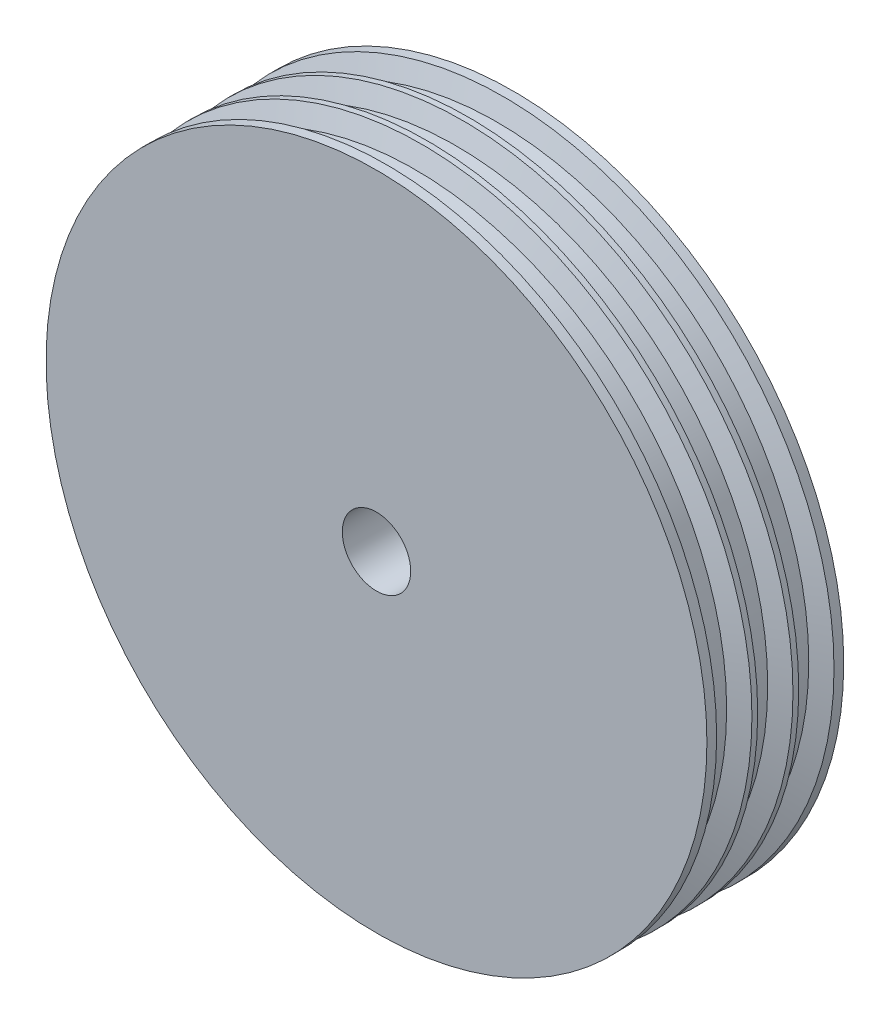
ISO-10303-21;
HEADER;
FILE_DESCRIPTION(('STEP AP214'),'2;1');
FILE_NAME('part.step','',(''),(''),'','','');
FILE_SCHEMA(('AUTOMOTIVE_DESIGN { 1 0 10303 214 1 1 1 1 }'));
ENDSEC;
DATA;
#1=APPLICATION_CONTEXT('core data for automotive mechanical design processes');
#2=APPLICATION_PROTOCOL_DEFINITION('international standard','automotive_design',2000,#1);
#3=PRODUCT_CONTEXT('',#1,'mechanical');
#4=PRODUCT('Part','Part','',(#3));
#5=PRODUCT_RELATED_PRODUCT_CATEGORY('part','',(#4));
#6=PRODUCT_DEFINITION_FORMATION('','',#4);
#7=PRODUCT_DEFINITION_CONTEXT('part definition',#1,'design');
#8=PRODUCT_DEFINITION('design','',#6,#7);
#9=PRODUCT_DEFINITION_SHAPE('','',#8);
#10=(LENGTH_UNIT() NAMED_UNIT(*) SI_UNIT(.MILLI.,.METRE.));
#11=(NAMED_UNIT(*) PLANE_ANGLE_UNIT() SI_UNIT($,.RADIAN.));
#12=(NAMED_UNIT(*) SI_UNIT($,.STERADIAN.) SOLID_ANGLE_UNIT());
#13=UNCERTAINTY_MEASURE_WITH_UNIT(LENGTH_MEASURE(1.E-05),#10,'distance_accuracy_value','');
#14=(GEOMETRIC_REPRESENTATION_CONTEXT(3) GLOBAL_UNCERTAINTY_ASSIGNED_CONTEXT((#13)) GLOBAL_UNIT_ASSIGNED_CONTEXT((#10,
#11,#12)) REPRESENTATION_CONTEXT('',''));
#15=CARTESIAN_POINT('',(0.,0.,0.));
#16=DIRECTION('',(0.,0.,1.));
#17=DIRECTION('',(1.,0.,0.));
#18=AXIS2_PLACEMENT_3D('',#15,#16,#17);
#19=CARTESIAN_POINT('',(0.,120.75,0.));
#20=DIRECTION('',(0.,0.,-1.));
#21=DIRECTION('',(-1.,0.,0.));
#22=AXIS2_PLACEMENT_3D('',#19,#20,#21);
#23=PLANE('',#22);
#24=CARTESIAN_POINT('',(0.,0.,0.));
#25=DIRECTION('',(0.,0.,1.));
#26=DIRECTION('',(1.,0.,0.));
#27=AXIS2_PLACEMENT_3D('',#24,#25,#26);
#28=CIRCLE('',#27,12.5);
#29=CARTESIAN_POINT('',(12.5,0.,0.));
#30=VERTEX_POINT('',#29);
#31=EDGE_CURVE('E10',#30,#30,#28,.T.);
#32=ORIENTED_EDGE('',*,*,#31,.F.);
#33=EDGE_LOOP('',(#32));
#34=FACE_BOUND('',#33,.T.);
#35=CARTESIAN_POINT('',(0.,0.,0.));
#36=DIRECTION('',(0.,0.,1.));
#37=DIRECTION('',(1.,0.,0.));
#38=AXIS2_PLACEMENT_3D('',#35,#36,#37);
#39=CIRCLE('',#38,120.75);
#40=CARTESIAN_POINT('',(120.75,0.,0.));
#41=VERTEX_POINT('',#40);
#42=EDGE_CURVE('E110',#41,#41,#39,.T.);
#43=ORIENTED_EDGE('',*,*,#42,.T.);
#44=EDGE_LOOP('',(#43));
#45=FACE_BOUND('',#44,.T.);
#46=ADVANCED_FACE('F43',(#34,#45),#23,.F.);
#47=CARTESIAN_POINT('',(0.,0.,0.));
#48=DIRECTION('',(0.,0.,1.));
#49=DIRECTION('',(1.,0.,0.));
#50=AXIS2_PLACEMENT_3D('',#47,#48,#49);
#51=CYLINDRICAL_SURFACE('',#50,12.5);
#52=CARTESIAN_POINT('',(0.,0.,-50.));
#53=DIRECTION('',(0.,0.,1.));
#54=DIRECTION('',(1.,0.,0.));
#55=AXIS2_PLACEMENT_3D('',#52,#53,#54);
#56=CIRCLE('',#55,12.5);
#57=CARTESIAN_POINT('',(12.5,0.,-50.));
#58=VERTEX_POINT('',#57);
#59=EDGE_CURVE('E50',#58,#58,#56,.T.);
#60=ORIENTED_EDGE('',*,*,#59,.F.);
#61=EDGE_LOOP('',(#60));
#62=FACE_BOUND('',#61,.T.);
#63=ORIENTED_EDGE('',*,*,#31,.T.);
#64=EDGE_LOOP('',(#63));
#65=FACE_BOUND('',#64,.T.);
#66=ADVANCED_FACE('F196',(#62,#65),#51,.F.);
#67=CARTESIAN_POINT('',(0.,120.75,-50.));
#68=DIRECTION('',(0.,0.,1.));
#69=DIRECTION('',(1.,0.,0.));
#70=AXIS2_PLACEMENT_3D('',#67,#68,#69);
#71=PLANE('',#70);
#72=CARTESIAN_POINT('',(0.,0.,-50.));
#73=DIRECTION('',(0.,0.,1.));
#74=DIRECTION('',(1.,0.,0.));
#75=AXIS2_PLACEMENT_3D('',#72,#73,#74);
#76=CIRCLE('',#75,120.75);
#77=CARTESIAN_POINT('',(120.75,0.,-50.));
#78=VERTEX_POINT('',#77);
#79=EDGE_CURVE('E55',#78,#78,#76,.T.);
#80=ORIENTED_EDGE('',*,*,#79,.F.);
#81=EDGE_LOOP('',(#80));
#82=FACE_BOUND('',#81,.T.);
#83=ORIENTED_EDGE('',*,*,#59,.T.);
#84=EDGE_LOOP('',(#83));
#85=FACE_BOUND('',#84,.T.);
#86=ADVANCED_FACE('F191',(#82,#85),#71,.F.);
#87=CARTESIAN_POINT('',(0.,0.,0.));
#88=DIRECTION('',(0.,0.,1.));
#89=DIRECTION('',(1.,0.,0.));
#90=AXIS2_PLACEMENT_3D('',#87,#88,#89);
#91=CYLINDRICAL_SURFACE('',#90,120.75);
#92=CARTESIAN_POINT('',(0.,0.,-46.4469009365466));
#93=DIRECTION('',(0.,0.,1.));
#94=DIRECTION('',(1.,0.,0.));
#95=AXIS2_PLACEMENT_3D('',#92,#93,#94);
#96=CIRCLE('',#95,120.75);
#97=CARTESIAN_POINT('',(120.75,0.,-46.4469009365466));
#98=VERTEX_POINT('',#97);
#99=EDGE_CURVE('E60',#98,#98,#96,.T.);
#100=ORIENTED_EDGE('',*,*,#99,.F.);
#101=EDGE_LOOP('',(#100));
#102=FACE_BOUND('',#101,.T.);
#103=ORIENTED_EDGE('',*,*,#79,.T.);
#104=EDGE_LOOP('',(#103));
#105=FACE_BOUND('',#104,.T.);
#106=ADVANCED_FACE('F185',(#102,#105),#91,.T.);
#107=CARTESIAN_POINT('',(0.,0.,-46.4469009365466));
#108=DIRECTION('',(0.,0.,-1.));
#109=DIRECTION('',(-1.,0.,0.));
#110=AXIS2_PLACEMENT_3D('',#107,#108,#109);
#111=CONICAL_SURFACE('',#110,120.75,1.23918376891597);
#112=CARTESIAN_POINT('',(0.,0.,-44.0817349666014));
#113=DIRECTION('',(0.,0.,1.));
#114=DIRECTION('',(1.,0.,0.));
#115=AXIS2_PLACEMENT_3D('',#112,#113,#114);
#116=CIRCLE('',#115,113.881059262577);
#117=CARTESIAN_POINT('',(113.881059262577,0.,-44.0817349666014));
#118=VERTEX_POINT('',#117);
#119=EDGE_CURVE('E66',#118,#118,#116,.T.);
#120=ORIENTED_EDGE('',*,*,#119,.F.);
#121=EDGE_LOOP('',(#120));
#122=FACE_BOUND('',#121,.T.);
#123=ORIENTED_EDGE('',*,*,#99,.T.);
#124=EDGE_LOOP('',(#123));
#125=FACE_BOUND('',#124,.T.);
#126=ADVANCED_FACE('F179',(#122,#125),#111,.T.);
#127=CARTESIAN_POINT('',(0.,0.,0.));
#128=DIRECTION('',(0.,0.,1.));
#129=DIRECTION('',(1.,0.,0.));
#130=AXIS2_PLACEMENT_3D('',#127,#128,#129);
#131=CYLINDRICAL_SURFACE('',#130,113.881059262577);
#132=CARTESIAN_POINT('',(0.,0.,-35.9182650333986));
#133=DIRECTION('',(0.,0.,1.));
#134=DIRECTION('',(1.,0.,0.));
#135=AXIS2_PLACEMENT_3D('',#132,#133,#134);
#136=CIRCLE('',#135,113.881059262577);
#137=CARTESIAN_POINT('',(113.881059262577,0.,-35.9182650333986));
#138=VERTEX_POINT('',#137);
#139=EDGE_CURVE('E70',#138,#138,#136,.T.);
#140=ORIENTED_EDGE('',*,*,#139,.F.);
#141=EDGE_LOOP('',(#140));
#142=FACE_BOUND('',#141,.T.);
#143=ORIENTED_EDGE('',*,*,#119,.T.);
#144=EDGE_LOOP('',(#143));
#145=FACE_BOUND('',#144,.T.);
#146=ADVANCED_FACE('F173',(#142,#145),#131,.T.);
#147=CARTESIAN_POINT('',(0.,0.,-35.9182650333986));
#148=DIRECTION('',(0.,0.,1.));
#149=DIRECTION('',(1.,0.,0.));
#150=AXIS2_PLACEMENT_3D('',#147,#148,#149);
#151=CONICAL_SURFACE('',#150,113.881059262577,1.23918376891597);
#152=CARTESIAN_POINT('',(0.,0.,-33.5530990634534));
#153=DIRECTION('',(0.,0.,1.));
#154=DIRECTION('',(1.,0.,0.));
#155=AXIS2_PLACEMENT_3D('',#152,#153,#154);
#156=CIRCLE('',#155,120.75);
#157=CARTESIAN_POINT('',(120.75,0.,-33.5530990634534));
#158=VERTEX_POINT('',#157);
#159=EDGE_CURVE('E74',#158,#158,#156,.T.);
#160=ORIENTED_EDGE('',*,*,#159,.F.);
#161=EDGE_LOOP('',(#160));
#162=FACE_BOUND('',#161,.T.);
#163=ORIENTED_EDGE('',*,*,#139,.T.);
#164=EDGE_LOOP('',(#163));
#165=FACE_BOUND('',#164,.T.);
#166=ADVANCED_FACE('F167',(#162,#165),#151,.T.);
#167=CARTESIAN_POINT('',(0.,0.,0.));
#168=DIRECTION('',(0.,0.,1.));
#169=DIRECTION('',(1.,0.,0.));
#170=AXIS2_PLACEMENT_3D('',#167,#168,#169);
#171=CYLINDRICAL_SURFACE('',#170,120.75);
#172=CARTESIAN_POINT('',(0.,0.,-31.4469009365466));
#173=DIRECTION('',(0.,0.,1.));
#174=DIRECTION('',(1.,0.,0.));
#175=AXIS2_PLACEMENT_3D('',#172,#173,#174);
#176=CIRCLE('',#175,120.75);
#177=CARTESIAN_POINT('',(120.75,0.,-31.4469009365466));
#178=VERTEX_POINT('',#177);
#179=EDGE_CURVE('E78',#178,#178,#176,.T.);
#180=ORIENTED_EDGE('',*,*,#179,.F.);
#181=EDGE_LOOP('',(#180));
#182=FACE_BOUND('',#181,.T.);
#183=ORIENTED_EDGE('',*,*,#159,.T.);
#184=EDGE_LOOP('',(#183));
#185=FACE_BOUND('',#184,.T.);
#186=ADVANCED_FACE('F161',(#182,#185),#171,.T.);
#187=CARTESIAN_POINT('',(0.,0.,-31.4469009365466));
#188=DIRECTION('',(0.,0.,-1.));
#189=DIRECTION('',(-1.,0.,0.));
#190=AXIS2_PLACEMENT_3D('',#187,#188,#189);
#191=CONICAL_SURFACE('',#190,120.75,1.23918376891597);
#192=CARTESIAN_POINT('',(0.,0.,-29.0817349666014));
#193=DIRECTION('',(0.,0.,1.));
#194=DIRECTION('',(1.,0.,0.));
#195=AXIS2_PLACEMENT_3D('',#192,#193,#194);
#196=CIRCLE('',#195,113.881059262577);
#197=CARTESIAN_POINT('',(113.881059262577,0.,-29.0817349666014));
#198=VERTEX_POINT('',#197);
#199=EDGE_CURVE('E82',#198,#198,#196,.T.);
#200=ORIENTED_EDGE('',*,*,#199,.F.);
#201=EDGE_LOOP('',(#200));
#202=FACE_BOUND('',#201,.T.);
#203=ORIENTED_EDGE('',*,*,#179,.T.);
#204=EDGE_LOOP('',(#203));
#205=FACE_BOUND('',#204,.T.);
#206=ADVANCED_FACE('F155',(#202,#205),#191,.T.);
#207=CARTESIAN_POINT('',(0.,0.,0.));
#208=DIRECTION('',(0.,0.,1.));
#209=DIRECTION('',(1.,0.,0.));
#210=AXIS2_PLACEMENT_3D('',#207,#208,#209);
#211=CYLINDRICAL_SURFACE('',#210,113.881059262577);
#212=CARTESIAN_POINT('',(0.,0.,-20.9182650333986));
#213=DIRECTION('',(0.,0.,1.));
#214=DIRECTION('',(1.,0.,0.));
#215=AXIS2_PLACEMENT_3D('',#212,#213,#214);
#216=CIRCLE('',#215,113.881059262577);
#217=CARTESIAN_POINT('',(113.881059262577,0.,-20.9182650333986));
#218=VERTEX_POINT('',#217);
#219=EDGE_CURVE('E86',#218,#218,#216,.T.);
#220=ORIENTED_EDGE('',*,*,#219,.F.);
#221=EDGE_LOOP('',(#220));
#222=FACE_BOUND('',#221,.T.);
#223=ORIENTED_EDGE('',*,*,#199,.T.);
#224=EDGE_LOOP('',(#223));
#225=FACE_BOUND('',#224,.T.);
#226=ADVANCED_FACE('F149',(#222,#225),#211,.T.);
#227=CARTESIAN_POINT('',(0.,0.,-20.9182650333986));
#228=DIRECTION('',(0.,0.,1.));
#229=DIRECTION('',(1.,0.,0.));
#230=AXIS2_PLACEMENT_3D('',#227,#228,#229);
#231=CONICAL_SURFACE('',#230,113.881059262577,1.23918376891597);
#232=CARTESIAN_POINT('',(0.,0.,-18.5530990634534));
#233=DIRECTION('',(0.,0.,1.));
#234=DIRECTION('',(1.,0.,0.));
#235=AXIS2_PLACEMENT_3D('',#232,#233,#234);
#236=CIRCLE('',#235,120.75);
#237=CARTESIAN_POINT('',(120.75,0.,-18.5530990634534));
#238=VERTEX_POINT('',#237);
#239=EDGE_CURVE('E90',#238,#238,#236,.T.);
#240=ORIENTED_EDGE('',*,*,#239,.F.);
#241=EDGE_LOOP('',(#240));
#242=FACE_BOUND('',#241,.T.);
#243=ORIENTED_EDGE('',*,*,#219,.T.);
#244=EDGE_LOOP('',(#243));
#245=FACE_BOUND('',#244,.T.);
#246=ADVANCED_FACE('F143',(#242,#245),#231,.T.);
#247=CARTESIAN_POINT('',(0.,0.,0.));
#248=DIRECTION('',(0.,0.,1.));
#249=DIRECTION('',(1.,0.,0.));
#250=AXIS2_PLACEMENT_3D('',#247,#248,#249);
#251=CYLINDRICAL_SURFACE('',#250,120.75);
#252=CARTESIAN_POINT('',(0.,0.,-16.4469009365466));
#253=DIRECTION('',(0.,0.,1.));
#254=DIRECTION('',(1.,0.,0.));
#255=AXIS2_PLACEMENT_3D('',#252,#253,#254);
#256=CIRCLE('',#255,120.75);
#257=CARTESIAN_POINT('',(120.75,0.,-16.4469009365466));
#258=VERTEX_POINT('',#257);
#259=EDGE_CURVE('E94',#258,#258,#256,.T.);
#260=ORIENTED_EDGE('',*,*,#259,.F.);
#261=EDGE_LOOP('',(#260));
#262=FACE_BOUND('',#261,.T.);
#263=ORIENTED_EDGE('',*,*,#239,.T.);
#264=EDGE_LOOP('',(#263));
#265=FACE_BOUND('',#264,.T.);
#266=ADVANCED_FACE('F137',(#262,#265),#251,.T.);
#267=CARTESIAN_POINT('',(0.,0.,-16.4469009365466));
#268=DIRECTION('',(0.,0.,-1.));
#269=DIRECTION('',(-1.,0.,0.));
#270=AXIS2_PLACEMENT_3D('',#267,#268,#269);
#271=CONICAL_SURFACE('',#270,120.75,1.23918376891597);
#272=CARTESIAN_POINT('',(0.,0.,-14.0817349666014));
#273=DIRECTION('',(0.,0.,1.));
#274=DIRECTION('',(1.,0.,0.));
#275=AXIS2_PLACEMENT_3D('',#272,#273,#274);
#276=CIRCLE('',#275,113.881059262577);
#277=CARTESIAN_POINT('',(113.881059262577,0.,-14.0817349666014));
#278=VERTEX_POINT('',#277);
#279=EDGE_CURVE('E98',#278,#278,#276,.T.);
#280=ORIENTED_EDGE('',*,*,#279,.F.);
#281=EDGE_LOOP('',(#280));
#282=FACE_BOUND('',#281,.T.);
#283=ORIENTED_EDGE('',*,*,#259,.T.);
#284=EDGE_LOOP('',(#283));
#285=FACE_BOUND('',#284,.T.);
#286=ADVANCED_FACE('F131',(#282,#285),#271,.T.);
#287=CARTESIAN_POINT('',(0.,0.,0.));
#288=DIRECTION('',(0.,0.,1.));
#289=DIRECTION('',(1.,0.,0.));
#290=AXIS2_PLACEMENT_3D('',#287,#288,#289);
#291=CYLINDRICAL_SURFACE('',#290,113.881059262577);
#292=CARTESIAN_POINT('',(0.,0.,-5.91826503339862));
#293=DIRECTION('',(0.,0.,1.));
#294=DIRECTION('',(1.,0.,0.));
#295=AXIS2_PLACEMENT_3D('',#292,#293,#294);
#296=CIRCLE('',#295,113.881059262577);
#297=CARTESIAN_POINT('',(113.881059262577,0.,-5.91826503339862));
#298=VERTEX_POINT('',#297);
#299=EDGE_CURVE('E102',#298,#298,#296,.T.);
#300=ORIENTED_EDGE('',*,*,#299,.F.);
#301=EDGE_LOOP('',(#300));
#302=FACE_BOUND('',#301,.T.);
#303=ORIENTED_EDGE('',*,*,#279,.T.);
#304=EDGE_LOOP('',(#303));
#305=FACE_BOUND('',#304,.T.);
#306=ADVANCED_FACE('F125',(#302,#305),#291,.T.);
#307=CARTESIAN_POINT('',(0.,0.,-5.91826503339862));
#308=DIRECTION('',(0.,0.,1.));
#309=DIRECTION('',(1.,0.,0.));
#310=AXIS2_PLACEMENT_3D('',#307,#308,#309);
#311=CONICAL_SURFACE('',#310,113.881059262577,1.23918376891597);
#312=CARTESIAN_POINT('',(0.,0.,-3.5530990634534));
#313=DIRECTION('',(0.,0.,1.));
#314=DIRECTION('',(1.,0.,0.));
#315=AXIS2_PLACEMENT_3D('',#312,#313,#314);
#316=CIRCLE('',#315,120.75);
#317=CARTESIAN_POINT('',(120.75,0.,-3.5530990634534));
#318=VERTEX_POINT('',#317);
#319=EDGE_CURVE('E106',#318,#318,#316,.T.);
#320=ORIENTED_EDGE('',*,*,#319,.F.);
#321=EDGE_LOOP('',(#320));
#322=FACE_BOUND('',#321,.T.);
#323=ORIENTED_EDGE('',*,*,#299,.T.);
#324=EDGE_LOOP('',(#323));
#325=FACE_BOUND('',#324,.T.);
#326=ADVANCED_FACE('F119',(#322,#325),#311,.T.);
#327=CARTESIAN_POINT('',(0.,0.,0.));
#328=DIRECTION('',(0.,0.,1.));
#329=DIRECTION('',(1.,0.,0.));
#330=AXIS2_PLACEMENT_3D('',#327,#328,#329);
#331=CYLINDRICAL_SURFACE('',#330,120.75);
#332=ORIENTED_EDGE('',*,*,#42,.F.);
#333=EDGE_LOOP('',(#332));
#334=FACE_BOUND('',#333,.T.);
#335=ORIENTED_EDGE('',*,*,#319,.T.);
#336=EDGE_LOOP('',(#335));
#337=FACE_BOUND('',#336,.T.);
#338=ADVANCED_FACE('F116',(#334,#337),#331,.T.);
#339=CLOSED_SHELL('',(#46,#66,#86,#106,#126,#146,#166,#186,#206,#226,#246,#266,#286,#306,#326,#338));
#340=MANIFOLD_SOLID_BREP('B2',#339);
#341=ADVANCED_BREP_SHAPE_REPRESENTATION('',(#18,#340),#14);
#342=SHAPE_DEFINITION_REPRESENTATION(#9,#341);
ENDSEC;
END-ISO-10303-21;
